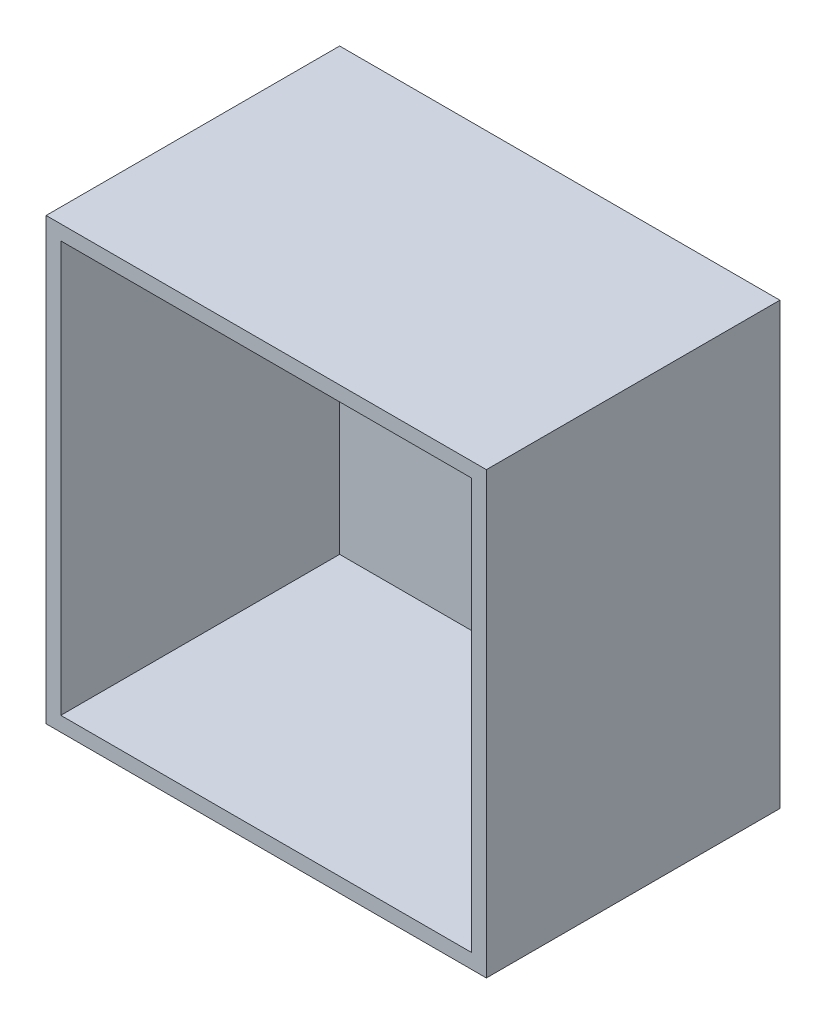
ISO-10303-21;
HEADER;
FILE_DESCRIPTION(('STEP AP214'),'2;1');
FILE_NAME('part.step','',(''),(''),'','','');
FILE_SCHEMA(('AUTOMOTIVE_DESIGN { 1 0 10303 214 1 1 1 1 }'));
ENDSEC;
DATA;
#1=APPLICATION_CONTEXT('core data for automotive mechanical design processes');
#2=APPLICATION_PROTOCOL_DEFINITION('international standard','automotive_design',2000,#1);
#3=PRODUCT_CONTEXT('',#1,'mechanical');
#4=PRODUCT('Part','Part','',(#3));
#5=PRODUCT_RELATED_PRODUCT_CATEGORY('part','',(#4));
#6=PRODUCT_DEFINITION_FORMATION('','',#4);
#7=PRODUCT_DEFINITION_CONTEXT('part definition',#1,'design');
#8=PRODUCT_DEFINITION('design','',#6,#7);
#9=PRODUCT_DEFINITION_SHAPE('','',#8);
#10=(LENGTH_UNIT() NAMED_UNIT(*) SI_UNIT(.MILLI.,.METRE.));
#11=(NAMED_UNIT(*) PLANE_ANGLE_UNIT() SI_UNIT($,.RADIAN.));
#12=(NAMED_UNIT(*) SI_UNIT($,.STERADIAN.) SOLID_ANGLE_UNIT());
#13=UNCERTAINTY_MEASURE_WITH_UNIT(LENGTH_MEASURE(1.E-05),#10,'distance_accuracy_value','');
#14=(GEOMETRIC_REPRESENTATION_CONTEXT(3) GLOBAL_UNCERTAINTY_ASSIGNED_CONTEXT((#13)) GLOBAL_UNIT_ASSIGNED_CONTEXT((#10,
#11,#12)) REPRESENTATION_CONTEXT('',''));
#15=CARTESIAN_POINT('',(0.,0.,0.));
#16=DIRECTION('',(0.,0.,1.));
#17=DIRECTION('',(1.,0.,0.));
#18=AXIS2_PLACEMENT_3D('',#15,#16,#17);
#19=CARTESIAN_POINT('',(0.,0.,50.8));
#20=DIRECTION('',(0.,0.,-1.));
#21=DIRECTION('',(-1.,0.,0.));
#22=AXIS2_PLACEMENT_3D('',#19,#20,#21);
#23=PLANE('',#22);
#24=DIRECTION('',(0.,-1.,0.));
#25=VECTOR('',#24,1.);
#26=CARTESIAN_POINT('',(0.,0.,50.8));
#27=LINE('',#26,#25);
#28=CARTESIAN_POINT('',(0.,76.2,50.8));
#29=VERTEX_POINT('',#28);
#30=CARTESIAN_POINT('',(0.,0.,50.8));
#31=VERTEX_POINT('',#30);
#32=EDGE_CURVE('E147',#29,#31,#27,.T.);
#33=ORIENTED_EDGE('',*,*,#32,.T.);
#34=DIRECTION('',(1.,0.,0.));
#35=VECTOR('',#34,1.);
#36=CARTESIAN_POINT('',(0.,0.,50.8));
#37=LINE('',#36,#35);
#38=CARTESIAN_POINT('',(76.2,0.,50.8));
#39=VERTEX_POINT('',#38);
#40=EDGE_CURVE('E91',#31,#39,#37,.T.);
#41=ORIENTED_EDGE('',*,*,#40,.T.);
#42=DIRECTION('',(0.,1.,0.));
#43=VECTOR('',#42,1.);
#44=CARTESIAN_POINT('',(76.2,0.,50.8));
#45=LINE('',#44,#43);
#46=CARTESIAN_POINT('',(76.2,76.2,50.8));
#47=VERTEX_POINT('',#46);
#48=EDGE_CURVE('E150',#39,#47,#45,.T.);
#49=ORIENTED_EDGE('',*,*,#48,.T.);
#50=DIRECTION('',(-1.,0.,0.));
#51=VECTOR('',#50,1.);
#52=CARTESIAN_POINT('',(0.,76.2,50.8));
#53=LINE('',#52,#51);
#54=EDGE_CURVE('E63',#47,#29,#53,.T.);
#55=ORIENTED_EDGE('',*,*,#54,.T.);
#56=EDGE_LOOP('',(#33,#41,#49,#55));
#57=FACE_BOUND('',#56,.T.);
#58=DIRECTION('',(0.,-1.,0.));
#59=VECTOR('',#58,1.);
#60=CARTESIAN_POINT('',(2.54,0.,50.8));
#61=LINE('',#60,#59);
#62=CARTESIAN_POINT('',(2.54,73.66,50.8));
#63=VERTEX_POINT('',#62);
#64=CARTESIAN_POINT('',(2.54,2.54,50.8));
#65=VERTEX_POINT('',#64);
#66=EDGE_CURVE('E136',#63,#65,#61,.T.);
#67=ORIENTED_EDGE('',*,*,#66,.F.);
#68=DIRECTION('',(-1.,0.,0.));
#69=VECTOR('',#68,1.);
#70=CARTESIAN_POINT('',(0.,73.66,50.8));
#71=LINE('',#70,#69);
#72=CARTESIAN_POINT('',(73.66,73.66,50.8));
#73=VERTEX_POINT('',#72);
#74=EDGE_CURVE('E145',#73,#63,#71,.T.);
#75=ORIENTED_EDGE('',*,*,#74,.F.);
#76=DIRECTION('',(0.,1.,0.));
#77=VECTOR('',#76,1.);
#78=CARTESIAN_POINT('',(73.66,0.,50.8));
#79=LINE('',#78,#77);
#80=CARTESIAN_POINT('',(73.66,2.54,50.8));
#81=VERTEX_POINT('',#80);
#82=EDGE_CURVE('E143',#81,#73,#79,.T.);
#83=ORIENTED_EDGE('',*,*,#82,.F.);
#84=DIRECTION('',(1.,0.,0.));
#85=VECTOR('',#84,1.);
#86=CARTESIAN_POINT('',(0.,2.54,50.8));
#87=LINE('',#86,#85);
#88=EDGE_CURVE('E128',#65,#81,#87,.T.);
#89=ORIENTED_EDGE('',*,*,#88,.F.);
#90=EDGE_LOOP('',(#67,#75,#83,#89));
#91=FACE_BOUND('',#90,.T.);
#92=ADVANCED_FACE('F39',(#57,#91),#23,.F.);
#93=CARTESIAN_POINT('',(0.,0.,50.8));
#94=DIRECTION('',(1.,0.,0.));
#95=DIRECTION('',(0.,0.,-1.));
#96=AXIS2_PLACEMENT_3D('',#93,#94,#95);
#97=PLANE('',#96);
#98=DIRECTION('',(0.,-1.,0.));
#99=VECTOR('',#98,1.);
#100=CARTESIAN_POINT('',(0.,0.,0.));
#101=LINE('',#100,#99);
#102=CARTESIAN_POINT('',(0.,76.2,0.));
#103=VERTEX_POINT('',#102);
#104=CARTESIAN_POINT('',(0.,0.,0.));
#105=VERTEX_POINT('',#104);
#106=EDGE_CURVE('E154',#103,#105,#101,.T.);
#107=ORIENTED_EDGE('',*,*,#106,.T.);
#108=DIRECTION('',(0.,0.,-1.));
#109=VECTOR('',#108,1.);
#110=CARTESIAN_POINT('',(0.,0.,50.8));
#111=LINE('',#110,#109);
#112=EDGE_CURVE('E11',#31,#105,#111,.T.);
#113=ORIENTED_EDGE('',*,*,#112,.F.);
#114=ORIENTED_EDGE('',*,*,#32,.F.);
#115=DIRECTION('',(0.,0.,-1.));
#116=VECTOR('',#115,1.);
#117=CARTESIAN_POINT('',(0.,76.2,50.8));
#118=LINE('',#117,#116);
#119=EDGE_CURVE('E153',#29,#103,#118,.T.);
#120=ORIENTED_EDGE('',*,*,#119,.T.);
#121=EDGE_LOOP('',(#107,#113,#114,#120));
#122=FACE_BOUND('',#121,.T.);
#123=ADVANCED_FACE('F41',(#122),#97,.F.);
#124=CARTESIAN_POINT('',(0.,0.,50.8));
#125=DIRECTION('',(0.,1.,0.));
#126=DIRECTION('',(0.,0.,1.));
#127=AXIS2_PLACEMENT_3D('',#124,#125,#126);
#128=PLANE('',#127);
#129=DIRECTION('',(1.,0.,0.));
#130=VECTOR('',#129,1.);
#131=CARTESIAN_POINT('',(0.,0.,0.));
#132=LINE('',#131,#130);
#133=CARTESIAN_POINT('',(76.2,0.,0.));
#134=VERTEX_POINT('',#133);
#135=EDGE_CURVE('E157',#105,#134,#132,.T.);
#136=ORIENTED_EDGE('',*,*,#135,.T.);
#137=DIRECTION('',(0.,0.,-1.));
#138=VECTOR('',#137,1.);
#139=CARTESIAN_POINT('',(76.2,0.,50.8));
#140=LINE('',#139,#138);
#141=EDGE_CURVE('E47',#39,#134,#140,.T.);
#142=ORIENTED_EDGE('',*,*,#141,.F.);
#143=ORIENTED_EDGE('',*,*,#40,.F.);
#144=ORIENTED_EDGE('',*,*,#112,.T.);
#145=EDGE_LOOP('',(#136,#142,#143,#144));
#146=FACE_BOUND('',#145,.T.);
#147=ADVANCED_FACE('F185',(#146),#128,.F.);
#148=CARTESIAN_POINT('',(76.2,0.,50.8));
#149=DIRECTION('',(-1.,0.,0.));
#150=DIRECTION('',(0.,0.,1.));
#151=AXIS2_PLACEMENT_3D('',#148,#149,#150);
#152=PLANE('',#151);
#153=DIRECTION('',(0.,1.,0.));
#154=VECTOR('',#153,1.);
#155=CARTESIAN_POINT('',(76.2,0.,0.));
#156=LINE('',#155,#154);
#157=CARTESIAN_POINT('',(76.2,76.2,0.));
#158=VERTEX_POINT('',#157);
#159=EDGE_CURVE('E159',#134,#158,#156,.T.);
#160=ORIENTED_EDGE('',*,*,#159,.T.);
#161=DIRECTION('',(0.,0.,-1.));
#162=VECTOR('',#161,1.);
#163=CARTESIAN_POINT('',(76.2,76.2,50.8));
#164=LINE('',#163,#162);
#165=EDGE_CURVE('E163',#47,#158,#164,.T.);
#166=ORIENTED_EDGE('',*,*,#165,.F.);
#167=ORIENTED_EDGE('',*,*,#48,.F.);
#168=ORIENTED_EDGE('',*,*,#141,.T.);
#169=EDGE_LOOP('',(#160,#166,#167,#168));
#170=FACE_BOUND('',#169,.T.);
#171=ADVANCED_FACE('F168',(#170),#152,.F.);
#172=CARTESIAN_POINT('',(0.,76.2,50.8));
#173=DIRECTION('',(0.,-1.,0.));
#174=DIRECTION('',(0.,0.,-1.));
#175=AXIS2_PLACEMENT_3D('',#172,#173,#174);
#176=PLANE('',#175);
#177=DIRECTION('',(-1.,0.,0.));
#178=VECTOR('',#177,1.);
#179=CARTESIAN_POINT('',(0.,76.2,0.));
#180=LINE('',#179,#178);
#181=EDGE_CURVE('E84',#158,#103,#180,.T.);
#182=ORIENTED_EDGE('',*,*,#181,.T.);
#183=ORIENTED_EDGE('',*,*,#119,.F.);
#184=ORIENTED_EDGE('',*,*,#54,.F.);
#185=ORIENTED_EDGE('',*,*,#165,.T.);
#186=EDGE_LOOP('',(#182,#183,#184,#185));
#187=FACE_BOUND('',#186,.T.);
#188=ADVANCED_FACE('F176',(#187),#176,.F.);
#189=CARTESIAN_POINT('',(0.,0.,0.));
#190=DIRECTION('',(0.,0.,-1.));
#191=DIRECTION('',(-1.,0.,0.));
#192=AXIS2_PLACEMENT_3D('',#189,#190,#191);
#193=PLANE('',#192);
#194=ORIENTED_EDGE('',*,*,#106,.F.);
#195=ORIENTED_EDGE('',*,*,#181,.F.);
#196=ORIENTED_EDGE('',*,*,#159,.F.);
#197=ORIENTED_EDGE('',*,*,#135,.F.);
#198=EDGE_LOOP('',(#194,#195,#196,#197));
#199=FACE_BOUND('',#198,.T.);
#200=ADVANCED_FACE('F172',(#199),#193,.T.);
#201=CARTESIAN_POINT('',(2.54,0.,50.8));
#202=DIRECTION('',(1.,0.,0.));
#203=DIRECTION('',(0.,0.,-1.));
#204=AXIS2_PLACEMENT_3D('',#201,#202,#203);
#205=PLANE('',#204);
#206=DIRECTION('',(0.,-1.,0.));
#207=VECTOR('',#206,1.);
#208=CARTESIAN_POINT('',(2.54,0.,2.54));
#209=LINE('',#208,#207);
#210=CARTESIAN_POINT('',(2.54,73.66,2.54));
#211=VERTEX_POINT('',#210);
#212=CARTESIAN_POINT('',(2.54,2.54,2.54));
#213=VERTEX_POINT('',#212);
#214=EDGE_CURVE('E119',#211,#213,#209,.T.);
#215=ORIENTED_EDGE('',*,*,#214,.F.);
#216=DIRECTION('',(0.,0.,-1.));
#217=VECTOR('',#216,1.);
#218=CARTESIAN_POINT('',(2.54,73.66,50.8));
#219=LINE('',#218,#217);
#220=EDGE_CURVE('E139',#63,#211,#219,.T.);
#221=ORIENTED_EDGE('',*,*,#220,.F.);
#222=ORIENTED_EDGE('',*,*,#66,.T.);
#223=DIRECTION('',(0.,0.,-1.));
#224=VECTOR('',#223,1.);
#225=CARTESIAN_POINT('',(2.54,2.54,50.8));
#226=LINE('',#225,#224);
#227=EDGE_CURVE('E131',#65,#213,#226,.T.);
#228=ORIENTED_EDGE('',*,*,#227,.T.);
#229=EDGE_LOOP('',(#215,#221,#222,#228));
#230=FACE_BOUND('',#229,.T.);
#231=ADVANCED_FACE('F183',(#230),#205,.T.);
#232=CARTESIAN_POINT('',(0.,2.54,50.8));
#233=DIRECTION('',(0.,1.,0.));
#234=DIRECTION('',(0.,0.,1.));
#235=AXIS2_PLACEMENT_3D('',#232,#233,#234);
#236=PLANE('',#235);
#237=DIRECTION('',(1.,0.,0.));
#238=VECTOR('',#237,1.);
#239=CARTESIAN_POINT('',(0.,2.54,2.54));
#240=LINE('',#239,#238);
#241=CARTESIAN_POINT('',(73.66,2.54,2.54));
#242=VERTEX_POINT('',#241);
#243=EDGE_CURVE('E113',#213,#242,#240,.T.);
#244=ORIENTED_EDGE('',*,*,#243,.F.);
#245=ORIENTED_EDGE('',*,*,#227,.F.);
#246=ORIENTED_EDGE('',*,*,#88,.T.);
#247=DIRECTION('',(0.,0.,-1.));
#248=VECTOR('',#247,1.);
#249=CARTESIAN_POINT('',(73.66,2.54,50.8));
#250=LINE('',#249,#248);
#251=EDGE_CURVE('E125',#81,#242,#250,.T.);
#252=ORIENTED_EDGE('',*,*,#251,.T.);
#253=EDGE_LOOP('',(#244,#245,#246,#252));
#254=FACE_BOUND('',#253,.T.);
#255=ADVANCED_FACE('F126',(#254),#236,.T.);
#256=CARTESIAN_POINT('',(73.66,0.,50.8));
#257=DIRECTION('',(-1.,0.,0.));
#258=DIRECTION('',(0.,0.,1.));
#259=AXIS2_PLACEMENT_3D('',#256,#257,#258);
#260=PLANE('',#259);
#261=DIRECTION('',(0.,1.,0.));
#262=VECTOR('',#261,1.);
#263=CARTESIAN_POINT('',(73.66,0.,2.54));
#264=LINE('',#263,#262);
#265=CARTESIAN_POINT('',(73.66,73.66,2.54));
#266=VERTEX_POINT('',#265);
#267=EDGE_CURVE('E117',#242,#266,#264,.T.);
#268=ORIENTED_EDGE('',*,*,#267,.F.);
#269=ORIENTED_EDGE('',*,*,#251,.F.);
#270=ORIENTED_EDGE('',*,*,#82,.T.);
#271=DIRECTION('',(0.,0.,-1.));
#272=VECTOR('',#271,1.);
#273=CARTESIAN_POINT('',(73.66,73.66,50.8));
#274=LINE('',#273,#272);
#275=EDGE_CURVE('E54',#73,#266,#274,.T.);
#276=ORIENTED_EDGE('',*,*,#275,.T.);
#277=EDGE_LOOP('',(#268,#269,#270,#276));
#278=FACE_BOUND('',#277,.T.);
#279=ADVANCED_FACE('F133',(#278),#260,.T.);
#280=CARTESIAN_POINT('',(0.,73.66,50.8));
#281=DIRECTION('',(0.,-1.,0.));
#282=DIRECTION('',(0.,0.,-1.));
#283=AXIS2_PLACEMENT_3D('',#280,#281,#282);
#284=PLANE('',#283);
#285=DIRECTION('',(-1.,0.,0.));
#286=VECTOR('',#285,1.);
#287=CARTESIAN_POINT('',(0.,73.66,2.54));
#288=LINE('',#287,#286);
#289=EDGE_CURVE('E134',#266,#211,#288,.T.);
#290=ORIENTED_EDGE('',*,*,#289,.F.);
#291=ORIENTED_EDGE('',*,*,#275,.F.);
#292=ORIENTED_EDGE('',*,*,#74,.T.);
#293=ORIENTED_EDGE('',*,*,#220,.T.);
#294=EDGE_LOOP('',(#290,#291,#292,#293));
#295=FACE_BOUND('',#294,.T.);
#296=ADVANCED_FACE('F197',(#295),#284,.T.);
#297=CARTESIAN_POINT('',(0.,0.,2.54));
#298=DIRECTION('',(0.,0.,-1.));
#299=DIRECTION('',(-1.,0.,0.));
#300=AXIS2_PLACEMENT_3D('',#297,#298,#299);
#301=PLANE('',#300);
#302=ORIENTED_EDGE('',*,*,#214,.T.);
#303=ORIENTED_EDGE('',*,*,#243,.T.);
#304=ORIENTED_EDGE('',*,*,#267,.T.);
#305=ORIENTED_EDGE('',*,*,#289,.T.);
#306=EDGE_LOOP('',(#302,#303,#304,#305));
#307=FACE_BOUND('',#306,.T.);
#308=ADVANCED_FACE('F115',(#307),#301,.F.);
#309=CLOSED_SHELL('',(#92,#123,#147,#171,#188,#200,#231,#255,#279,#296,#308));
#310=MANIFOLD_SOLID_BREP('B2',#309);
#311=ADVANCED_BREP_SHAPE_REPRESENTATION('',(#18,#310),#14);
#312=SHAPE_DEFINITION_REPRESENTATION(#9,#311);
ENDSEC;
END-ISO-10303-21;
